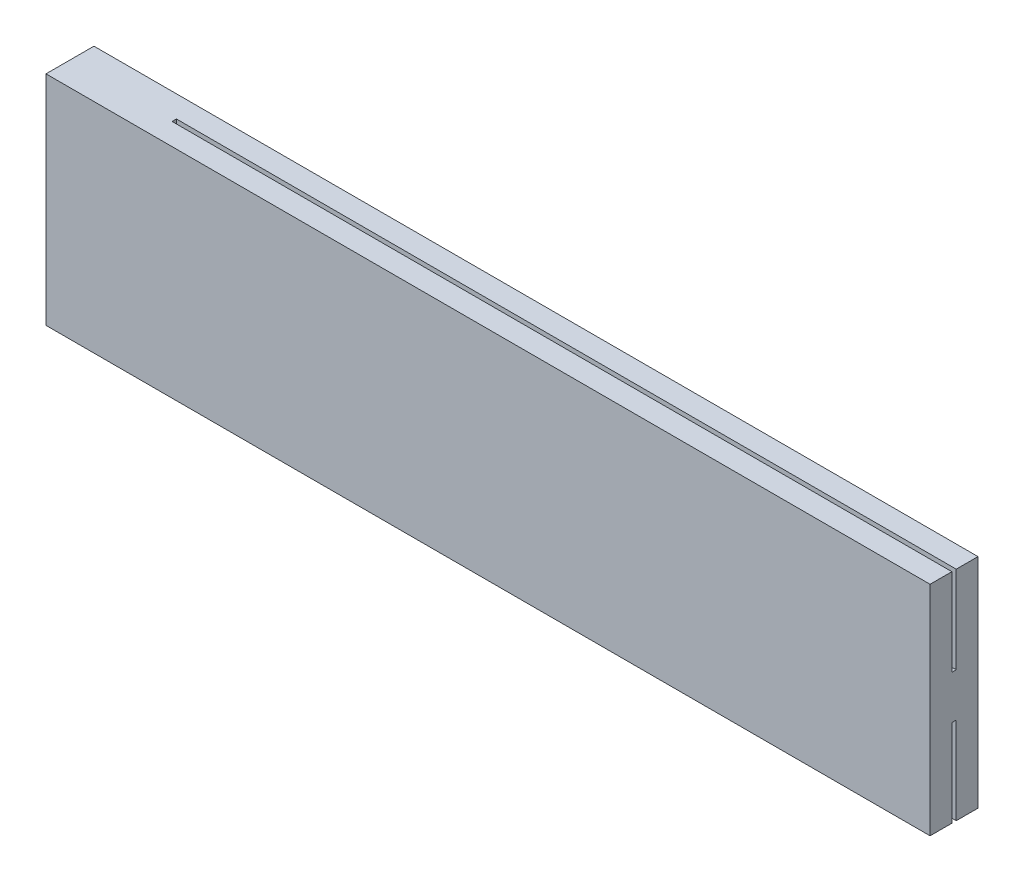
ISO-10303-21;
HEADER;
FILE_DESCRIPTION(('STEP AP214'),'2;1');
FILE_NAME('part.step','',(''),(''),'','','');
FILE_SCHEMA(('AUTOMOTIVE_DESIGN { 1 0 10303 214 1 1 1 1 }'));
ENDSEC;
DATA;
#1=APPLICATION_CONTEXT('core data for automotive mechanical design processes');
#2=APPLICATION_PROTOCOL_DEFINITION('international standard','automotive_design',2000,#1);
#3=PRODUCT_CONTEXT('',#1,'mechanical');
#4=PRODUCT('Part','Part','',(#3));
#5=PRODUCT_RELATED_PRODUCT_CATEGORY('part','',(#4));
#6=PRODUCT_DEFINITION_FORMATION('','',#4);
#7=PRODUCT_DEFINITION_CONTEXT('part definition',#1,'design');
#8=PRODUCT_DEFINITION('design','',#6,#7);
#9=PRODUCT_DEFINITION_SHAPE('','',#8);
#10=(LENGTH_UNIT() NAMED_UNIT(*) SI_UNIT(.MILLI.,.METRE.));
#11=(NAMED_UNIT(*) PLANE_ANGLE_UNIT() SI_UNIT($,.RADIAN.));
#12=(NAMED_UNIT(*) SI_UNIT($,.STERADIAN.) SOLID_ANGLE_UNIT());
#13=UNCERTAINTY_MEASURE_WITH_UNIT(LENGTH_MEASURE(1.E-05),#10,'distance_accuracy_value','');
#14=(GEOMETRIC_REPRESENTATION_CONTEXT(3) GLOBAL_UNCERTAINTY_ASSIGNED_CONTEXT((#13)) GLOBAL_UNIT_ASSIGNED_CONTEXT((#10,
#11,#12)) REPRESENTATION_CONTEXT('',''));
#15=CARTESIAN_POINT('',(0.,0.,0.));
#16=DIRECTION('',(0.,0.,1.));
#17=DIRECTION('',(1.,0.,0.));
#18=AXIS2_PLACEMENT_3D('',#15,#16,#17);
#19=CARTESIAN_POINT('',(269.280488051475,-140.,-12.));
#20=DIRECTION('',(0.,0.,1.));
#21=DIRECTION('',(0.,-1.,0.));
#22=AXIS2_PLACEMENT_3D('',#19,#20,#21);
#23=PLANE('',#22);
#24=DIRECTION('',(0.,1.,0.));
#25=VECTOR('',#24,1.);
#26=CARTESIAN_POINT('',(166.889082162113,-140.,-12.));
#27=LINE('',#26,#25);
#28=CARTESIAN_POINT('',(166.889082162113,-240.,-12.));
#29=VERTEX_POINT('',#28);
#30=CARTESIAN_POINT('',(166.889082162113,-140.,-12.));
#31=VERTEX_POINT('',#30);
#32=EDGE_CURVE('E187',#29,#31,#27,.T.);
#33=ORIENTED_EDGE('',*,*,#32,.F.);
#34=DIRECTION('',(-1.,0.,0.));
#35=VECTOR('',#34,1.);
#36=CARTESIAN_POINT('',(269.280488051475,-240.,-12.));
#37=LINE('',#36,#35);
#38=CARTESIAN_POINT('',(-238.865533981584,-240.,-12.));
#39=VERTEX_POINT('',#38);
#40=EDGE_CURVE('E173',#29,#39,#37,.T.);
#41=ORIENTED_EDGE('',*,*,#40,.T.);
#42=DIRECTION('',(0.,1.,0.));
#43=VECTOR('',#42,1.);
#44=CARTESIAN_POINT('',(-238.865533981584,-140.,-12.));
#45=LINE('',#44,#43);
#46=CARTESIAN_POINT('',(-238.865533981584,-140.,-12.));
#47=VERTEX_POINT('',#46);
#48=EDGE_CURVE('E170',#39,#47,#45,.T.);
#49=ORIENTED_EDGE('',*,*,#48,.T.);
#50=DIRECTION('',(-1.,0.,0.));
#51=VECTOR('',#50,1.);
#52=CARTESIAN_POINT('',(269.280488051475,-140.,-12.));
#53=LINE('',#52,#51);
#54=EDGE_CURVE('E194',#31,#47,#53,.T.);
#55=ORIENTED_EDGE('',*,*,#54,.F.);
#56=EDGE_LOOP('',(#33,#41,#49,#55));
#57=FACE_BOUND('',#56,.T.);
#58=ADVANCED_FACE('F34',(#57),#23,.F.);
#59=CARTESIAN_POINT('',(269.280488051475,-140.,-12.));
#60=DIRECTION('',(0.,-1.,0.));
#61=DIRECTION('',(0.,0.,-1.));
#62=AXIS2_PLACEMENT_3D('',#59,#60,#61);
#63=PLANE('',#62);
#64=DIRECTION('',(0.,0.,1.));
#65=VECTOR('',#64,1.);
#66=CARTESIAN_POINT('',(166.889082162113,-140.,-12.));
#67=LINE('',#66,#65);
#68=CARTESIAN_POINT('',(166.889082162113,-140.,0.));
#69=VERTEX_POINT('',#68);
#70=CARTESIAN_POINT('',(166.889082162113,-140.,9.99999999999998));
#71=VERTEX_POINT('',#70);
#72=EDGE_CURVE('E186',#69,#71,#67,.T.);
#73=ORIENTED_EDGE('',*,*,#72,.F.);
#74=DIRECTION('',(-1.,0.,0.));
#75=VECTOR('',#74,1.);
#76=CARTESIAN_POINT('',(269.280488051475,-140.,0.));
#77=LINE('',#76,#75);
#78=CARTESIAN_POINT('',(-191.,-140.,0.));
#79=VERTEX_POINT('',#78);
#80=EDGE_CURVE('E163',#69,#79,#77,.T.);
#81=ORIENTED_EDGE('',*,*,#80,.T.);
#82=DIRECTION('',(0.,0.,-1.));
#83=VECTOR('',#82,1.);
#84=CARTESIAN_POINT('',(-191.,-140.,-12.));
#85=LINE('',#84,#83);
#86=CARTESIAN_POINT('',(-191.,-140.,-2.));
#87=VERTEX_POINT('',#86);
#88=EDGE_CURVE('E207',#79,#87,#85,.T.);
#89=ORIENTED_EDGE('',*,*,#88,.T.);
#90=DIRECTION('',(-1.,0.,0.));
#91=VECTOR('',#90,1.);
#92=CARTESIAN_POINT('',(269.280488051475,-140.,-2.));
#93=LINE('',#92,#91);
#94=CARTESIAN_POINT('',(166.889082162113,-140.,-2.0000000000002));
#95=VERTEX_POINT('',#94);
#96=EDGE_CURVE('E161',#95,#87,#93,.T.);
#97=ORIENTED_EDGE('',*,*,#96,.F.);
#98=EDGE_CURVE('E183',#31,#95,#67,.T.);
#99=ORIENTED_EDGE('',*,*,#98,.F.);
#100=ORIENTED_EDGE('',*,*,#54,.T.);
#101=DIRECTION('',(0.,0.,1.));
#102=VECTOR('',#101,1.);
#103=CARTESIAN_POINT('',(-238.865533981584,-140.,-12.));
#104=LINE('',#103,#102);
#105=CARTESIAN_POINT('',(-238.865533981584,-140.,9.99999999999998));
#106=VERTEX_POINT('',#105);
#107=EDGE_CURVE('E166',#47,#106,#104,.T.);
#108=ORIENTED_EDGE('',*,*,#107,.T.);
#109=DIRECTION('',(-1.,0.,0.));
#110=VECTOR('',#109,1.);
#111=CARTESIAN_POINT('',(269.280488051475,-140.,9.99999999999998));
#112=LINE('',#111,#110);
#113=EDGE_CURVE('E196',#71,#106,#112,.T.);
#114=ORIENTED_EDGE('',*,*,#113,.F.);
#115=EDGE_LOOP('',(#73,#81,#89,#97,#99,#100,#108,#114));
#116=FACE_BOUND('',#115,.T.);
#117=ADVANCED_FACE('F227',(#116),#63,.F.);
#118=CARTESIAN_POINT('',(269.280488051475,-140.,9.99999999999998));
#119=DIRECTION('',(0.,0.,-1.));
#120=DIRECTION('',(0.,1.,0.));
#121=AXIS2_PLACEMENT_3D('',#118,#119,#120);
#122=PLANE('',#121);
#123=DIRECTION('',(0.,-1.,0.));
#124=VECTOR('',#123,1.);
#125=CARTESIAN_POINT('',(166.889082162113,-140.,9.99999999999998));
#126=LINE('',#125,#124);
#127=CARTESIAN_POINT('',(166.889082162113,-240.,9.99999999999995));
#128=VERTEX_POINT('',#127);
#129=EDGE_CURVE('E179',#71,#128,#126,.T.);
#130=ORIENTED_EDGE('',*,*,#129,.F.);
#131=ORIENTED_EDGE('',*,*,#113,.T.);
#132=DIRECTION('',(0.,-1.,0.));
#133=VECTOR('',#132,1.);
#134=CARTESIAN_POINT('',(-238.865533981584,-140.,9.99999999999998));
#135=LINE('',#134,#133);
#136=CARTESIAN_POINT('',(-238.865533981584,-240.,9.99999999999995));
#137=VERTEX_POINT('',#136);
#138=EDGE_CURVE('E169',#106,#137,#135,.T.);
#139=ORIENTED_EDGE('',*,*,#138,.T.);
#140=DIRECTION('',(-1.,0.,0.));
#141=VECTOR('',#140,1.);
#142=CARTESIAN_POINT('',(269.280488051475,-240.,9.99999999999995));
#143=LINE('',#142,#141);
#144=EDGE_CURVE('E198',#128,#137,#143,.T.);
#145=ORIENTED_EDGE('',*,*,#144,.F.);
#146=EDGE_LOOP('',(#130,#131,#139,#145));
#147=FACE_BOUND('',#146,.T.);
#148=ADVANCED_FACE('F224',(#147),#122,.F.);
#149=CARTESIAN_POINT('',(269.280488051475,-240.,-12.));
#150=DIRECTION('',(0.,1.,0.));
#151=DIRECTION('',(0.,0.,1.));
#152=AXIS2_PLACEMENT_3D('',#149,#150,#151);
#153=PLANE('',#152);
#154=DIRECTION('',(0.,0.,1.));
#155=VECTOR('',#154,1.);
#156=CARTESIAN_POINT('',(-191.,-240.,-12.));
#157=LINE('',#156,#155);
#158=CARTESIAN_POINT('',(-191.,-240.,-2.00000000000019));
#159=VERTEX_POINT('',#158);
#160=CARTESIAN_POINT('',(-191.,-240.,-1.89242561015651E-13));
#161=VERTEX_POINT('',#160);
#162=EDGE_CURVE('E11',#159,#161,#157,.T.);
#163=ORIENTED_EDGE('',*,*,#162,.T.);
#164=DIRECTION('',(1.,0.,0.));
#165=VECTOR('',#164,1.);
#166=CARTESIAN_POINT('',(269.280488051475,-240.,-1.90819582357449E-13));
#167=LINE('',#166,#165);
#168=CARTESIAN_POINT('',(166.889082162113,-240.,-1.89130056615707E-13));
#169=VERTEX_POINT('',#168);
#170=EDGE_CURVE('E147',#161,#169,#167,.T.);
#171=ORIENTED_EDGE('',*,*,#170,.T.);
#172=DIRECTION('',(0.,0.,-1.));
#173=VECTOR('',#172,1.);
#174=CARTESIAN_POINT('',(166.889082162113,-240.,-12.));
#175=LINE('',#174,#173);
#176=EDGE_CURVE('E190',#128,#169,#175,.T.);
#177=ORIENTED_EDGE('',*,*,#176,.F.);
#178=ORIENTED_EDGE('',*,*,#144,.T.);
#179=DIRECTION('',(0.,0.,-1.));
#180=VECTOR('',#179,1.);
#181=CARTESIAN_POINT('',(-238.865533981584,-240.,-12.));
#182=LINE('',#181,#180);
#183=EDGE_CURVE('E174',#137,#39,#182,.T.);
#184=ORIENTED_EDGE('',*,*,#183,.T.);
#185=ORIENTED_EDGE('',*,*,#40,.F.);
#186=CARTESIAN_POINT('',(166.889082162113,-240.,-1.99999999999939));
#187=VERTEX_POINT('',#186);
#188=EDGE_CURVE('E193',#187,#29,#175,.T.);
#189=ORIENTED_EDGE('',*,*,#188,.F.);
#190=DIRECTION('',(1.,0.,0.));
#191=VECTOR('',#190,1.);
#192=CARTESIAN_POINT('',(269.280488051475,-240.,-2.00000000000019));
#193=LINE('',#192,#191);
#194=EDGE_CURVE('E49',#159,#187,#193,.T.);
#195=ORIENTED_EDGE('',*,*,#194,.F.);
#196=EDGE_LOOP('',(#163,#171,#177,#178,#184,#185,#189,#195));
#197=FACE_BOUND('',#196,.T.);
#198=ADVANCED_FACE('F218',(#197),#153,.F.);
#199=CARTESIAN_POINT('',(166.889082162113,-434.321391588462,-2.0000000000002));
#200=DIRECTION('',(1.,0.,0.));
#201=DIRECTION('',(0.,1.,0.));
#202=AXIS2_PLACEMENT_3D('',#199,#200,#201);
#203=PLANE('',#202);
#204=DIRECTION('',(0.,-1.,0.));
#205=VECTOR('',#204,1.);
#206=CARTESIAN_POINT('',(166.889082162113,-434.321391588462,-9.24607612695638E-13));
#207=LINE('',#206,#205);
#208=CARTESIAN_POINT('',(166.889082162113,-200.,0.));
#209=VERTEX_POINT('',#208);
#210=EDGE_CURVE('E42',#209,#169,#207,.T.);
#211=ORIENTED_EDGE('',*,*,#210,.F.);
#212=DIRECTION('',(0.,0.,1.));
#213=VECTOR('',#212,1.);
#214=CARTESIAN_POINT('',(166.889082162113,-200.,-1.99999999999931));
#215=LINE('',#214,#213);
#216=CARTESIAN_POINT('',(166.889082162113,-200.,-2.00000000000004));
#217=VERTEX_POINT('',#216);
#218=EDGE_CURVE('E211',#217,#209,#215,.T.);
#219=ORIENTED_EDGE('',*,*,#218,.F.);
#220=DIRECTION('',(0.,-1.,0.));
#221=VECTOR('',#220,1.);
#222=CARTESIAN_POINT('',(166.889082162113,-434.321391588462,-2.0000000000002));
#223=LINE('',#222,#221);
#224=EDGE_CURVE('E140',#217,#187,#223,.T.);
#225=ORIENTED_EDGE('',*,*,#224,.T.);
#226=ORIENTED_EDGE('',*,*,#188,.T.);
#227=ORIENTED_EDGE('',*,*,#32,.T.);
#228=ORIENTED_EDGE('',*,*,#98,.T.);
#229=DIRECTION('',(0.,-1.,0.));
#230=VECTOR('',#229,1.);
#231=CARTESIAN_POINT('',(166.889082162113,-434.321391588462,-2.0000000000002));
#232=LINE('',#231,#230);
#233=CARTESIAN_POINT('',(166.889082162113,-180.,-2.0000000000002));
#234=VERTEX_POINT('',#233);
#235=EDGE_CURVE('E182',#95,#234,#232,.T.);
#236=ORIENTED_EDGE('',*,*,#235,.T.);
#237=DIRECTION('',(0.,0.,-1.));
#238=VECTOR('',#237,1.);
#239=CARTESIAN_POINT('',(166.889082162113,-180.,-2.0000000000002));
#240=LINE('',#239,#238);
#241=CARTESIAN_POINT('',(166.889082162113,-180.,0.));
#242=VERTEX_POINT('',#241);
#243=EDGE_CURVE('E203',#242,#234,#240,.T.);
#244=ORIENTED_EDGE('',*,*,#243,.F.);
#245=DIRECTION('',(0.,-1.,0.));
#246=VECTOR('',#245,1.);
#247=CARTESIAN_POINT('',(166.889082162113,-434.321391588462,0.));
#248=LINE('',#247,#246);
#249=EDGE_CURVE('E205',#69,#242,#248,.T.);
#250=ORIENTED_EDGE('',*,*,#249,.F.);
#251=ORIENTED_EDGE('',*,*,#72,.T.);
#252=ORIENTED_EDGE('',*,*,#129,.T.);
#253=ORIENTED_EDGE('',*,*,#176,.T.);
#254=EDGE_LOOP('',(#211,#219,#225,#226,#227,#228,#236,#244,#250,#251,#252,#253));
#255=FACE_BOUND('',#254,.T.);
#256=ADVANCED_FACE('F36',(#255),#203,.T.);
#257=CARTESIAN_POINT('',(-238.865533981584,-434.321391588462,9.99999999999993));
#258=DIRECTION('',(-1.,0.,0.));
#259=DIRECTION('',(0.,1.,0.));
#260=AXIS2_PLACEMENT_3D('',#257,#258,#259);
#261=PLANE('',#260);
#262=ORIENTED_EDGE('',*,*,#48,.F.);
#263=ORIENTED_EDGE('',*,*,#183,.F.);
#264=ORIENTED_EDGE('',*,*,#138,.F.);
#265=ORIENTED_EDGE('',*,*,#107,.F.);
#266=EDGE_LOOP('',(#262,#263,#264,#265));
#267=FACE_BOUND('',#266,.T.);
#268=ADVANCED_FACE('F232',(#267),#261,.T.);
#269=CARTESIAN_POINT('',(-191.,225.,-2.));
#270=DIRECTION('',(-1.,0.,0.));
#271=DIRECTION('',(0.,0.,1.));
#272=AXIS2_PLACEMENT_3D('',#269,#270,#271);
#273=PLANE('',#272);
#274=DIRECTION('',(0.,-1.,0.));
#275=VECTOR('',#274,1.);
#276=CARTESIAN_POINT('',(-191.,225.,0.));
#277=LINE('',#276,#275);
#278=CARTESIAN_POINT('',(-191.,-180.,0.));
#279=VERTEX_POINT('',#278);
#280=EDGE_CURVE('E150',#79,#279,#277,.T.);
#281=ORIENTED_EDGE('',*,*,#280,.T.);
#282=DIRECTION('',(0.,0.,1.));
#283=VECTOR('',#282,1.);
#284=CARTESIAN_POINT('',(-191.,-180.,-2.));
#285=LINE('',#284,#283);
#286=CARTESIAN_POINT('',(-191.,-180.,-2.));
#287=VERTEX_POINT('',#286);
#288=EDGE_CURVE('E155',#287,#279,#285,.T.);
#289=ORIENTED_EDGE('',*,*,#288,.F.);
#290=DIRECTION('',(0.,-1.,0.));
#291=VECTOR('',#290,1.);
#292=CARTESIAN_POINT('',(-191.,225.,-2.));
#293=LINE('',#292,#291);
#294=EDGE_CURVE('E151',#87,#287,#293,.T.);
#295=ORIENTED_EDGE('',*,*,#294,.F.);
#296=ORIENTED_EDGE('',*,*,#88,.F.);
#297=EDGE_LOOP('',(#281,#289,#295,#296));
#298=FACE_BOUND('',#297,.T.);
#299=ADVANCED_FACE('F244',(#298),#273,.F.);
#300=CARTESIAN_POINT('',(0.,0.,0.));
#301=DIRECTION('',(0.,0.,1.));
#302=DIRECTION('',(1.,0.,0.));
#303=AXIS2_PLACEMENT_3D('',#300,#301,#302);
#304=PLANE('',#303);
#305=ORIENTED_EDGE('',*,*,#249,.T.);
#306=DIRECTION('',(1.,0.,0.));
#307=VECTOR('',#306,1.);
#308=CARTESIAN_POINT('',(-191.,-180.,0.));
#309=LINE('',#308,#307);
#310=EDGE_CURVE('E153',#279,#242,#309,.T.);
#311=ORIENTED_EDGE('',*,*,#310,.F.);
#312=ORIENTED_EDGE('',*,*,#280,.F.);
#313=ORIENTED_EDGE('',*,*,#80,.F.);
#314=EDGE_LOOP('',(#305,#311,#312,#313));
#315=FACE_BOUND('',#314,.T.);
#316=ADVANCED_FACE('F250',(#315),#304,.F.);
#317=CARTESIAN_POINT('',(0.,0.,-2.));
#318=DIRECTION('',(0.,0.,1.));
#319=DIRECTION('',(1.,0.,0.));
#320=AXIS2_PLACEMENT_3D('',#317,#318,#319);
#321=PLANE('',#320);
#322=ORIENTED_EDGE('',*,*,#96,.T.);
#323=ORIENTED_EDGE('',*,*,#294,.T.);
#324=DIRECTION('',(1.,0.,0.));
#325=VECTOR('',#324,1.);
#326=CARTESIAN_POINT('',(-191.,-180.,-2.));
#327=LINE('',#326,#325);
#328=EDGE_CURVE('E57',#287,#234,#327,.T.);
#329=ORIENTED_EDGE('',*,*,#328,.T.);
#330=ORIENTED_EDGE('',*,*,#235,.F.);
#331=EDGE_LOOP('',(#322,#323,#329,#330));
#332=FACE_BOUND('',#331,.T.);
#333=ADVANCED_FACE('F241',(#332),#321,.T.);
#334=CARTESIAN_POINT('',(-191.,-180.,-2.));
#335=DIRECTION('',(0.,-1.,0.));
#336=DIRECTION('',(0.,0.,1.));
#337=AXIS2_PLACEMENT_3D('',#334,#335,#336);
#338=PLANE('',#337);
#339=ORIENTED_EDGE('',*,*,#243,.T.);
#340=ORIENTED_EDGE('',*,*,#328,.F.);
#341=ORIENTED_EDGE('',*,*,#288,.T.);
#342=ORIENTED_EDGE('',*,*,#310,.T.);
#343=EDGE_LOOP('',(#339,#340,#341,#342));
#344=FACE_BOUND('',#343,.T.);
#345=ADVANCED_FACE('F248',(#344),#338,.F.);
#346=CARTESIAN_POINT('',(-191.,-605.,-2.00000000000157));
#347=DIRECTION('',(-1.,0.,0.));
#348=DIRECTION('',(0.,0.,1.));
#349=AXIS2_PLACEMENT_3D('',#346,#347,#348);
#350=PLANE('',#349);
#351=DIRECTION('',(0.,1.,0.));
#352=VECTOR('',#351,1.);
#353=CARTESIAN_POINT('',(-191.,-605.,-2.00000000000157));
#354=LINE('',#353,#352);
#355=CARTESIAN_POINT('',(-191.,-200.,-2.00000000000004));
#356=VERTEX_POINT('',#355);
#357=EDGE_CURVE('E123',#159,#356,#354,.T.);
#358=ORIENTED_EDGE('',*,*,#357,.T.);
#359=DIRECTION('',(0.,0.,1.));
#360=VECTOR('',#359,1.);
#361=CARTESIAN_POINT('',(-191.,-200.,-2.00000000000004));
#362=LINE('',#361,#360);
#363=CARTESIAN_POINT('',(-191.,-200.,0.));
#364=VERTEX_POINT('',#363);
#365=EDGE_CURVE('E127',#356,#364,#362,.T.);
#366=ORIENTED_EDGE('',*,*,#365,.T.);
#367=DIRECTION('',(0.,1.,0.));
#368=VECTOR('',#367,1.);
#369=CARTESIAN_POINT('',(-191.,-605.,-1.57071325642991E-12));
#370=LINE('',#369,#368);
#371=EDGE_CURVE('E143',#161,#364,#370,.T.);
#372=ORIENTED_EDGE('',*,*,#371,.F.);
#373=ORIENTED_EDGE('',*,*,#162,.F.);
#374=EDGE_LOOP('',(#358,#366,#372,#373));
#375=FACE_BOUND('',#374,.T.);
#376=ADVANCED_FACE('F125',(#375),#350,.F.);
#377=CARTESIAN_POINT('',(0.,-380.,-7.19121731859478E-13));
#378=DIRECTION('',(0.,0.,1.));
#379=DIRECTION('',(1.,0.,0.));
#380=AXIS2_PLACEMENT_3D('',#377,#378,#379);
#381=PLANE('',#380);
#382=ORIENTED_EDGE('',*,*,#371,.T.);
#383=DIRECTION('',(1.,0.,0.));
#384=VECTOR('',#383,1.);
#385=CARTESIAN_POINT('',(-191.,-200.,0.));
#386=LINE('',#385,#384);
#387=EDGE_CURVE('E131',#364,#209,#386,.T.);
#388=ORIENTED_EDGE('',*,*,#387,.T.);
#389=ORIENTED_EDGE('',*,*,#210,.T.);
#390=ORIENTED_EDGE('',*,*,#170,.F.);
#391=EDGE_LOOP('',(#382,#388,#389,#390));
#392=FACE_BOUND('',#391,.T.);
#393=ADVANCED_FACE('F214',(#392),#381,.F.);
#394=CARTESIAN_POINT('',(0.,-380.,-2.00000000000072));
#395=DIRECTION('',(0.,0.,1.));
#396=DIRECTION('',(1.,0.,0.));
#397=AXIS2_PLACEMENT_3D('',#394,#395,#396);
#398=PLANE('',#397);
#399=ORIENTED_EDGE('',*,*,#194,.T.);
#400=ORIENTED_EDGE('',*,*,#224,.F.);
#401=DIRECTION('',(1.,0.,0.));
#402=VECTOR('',#401,1.);
#403=CARTESIAN_POINT('',(-191.,-200.,-2.00000000000004));
#404=LINE('',#403,#402);
#405=EDGE_CURVE('E130',#356,#217,#404,.T.);
#406=ORIENTED_EDGE('',*,*,#405,.F.);
#407=ORIENTED_EDGE('',*,*,#357,.F.);
#408=EDGE_LOOP('',(#399,#400,#406,#407));
#409=FACE_BOUND('',#408,.T.);
#410=ADVANCED_FACE('F139',(#409),#398,.T.);
#411=CARTESIAN_POINT('',(-191.,-200.,-2.00000000000004));
#412=DIRECTION('',(0.,1.,0.));
#413=DIRECTION('',(0.,0.,1.));
#414=AXIS2_PLACEMENT_3D('',#411,#412,#413);
#415=PLANE('',#414);
#416=ORIENTED_EDGE('',*,*,#218,.T.);
#417=ORIENTED_EDGE('',*,*,#387,.F.);
#418=ORIENTED_EDGE('',*,*,#365,.F.);
#419=ORIENTED_EDGE('',*,*,#405,.T.);
#420=EDGE_LOOP('',(#416,#417,#418,#419));
#421=FACE_BOUND('',#420,.T.);
#422=ADVANCED_FACE('F135',(#421),#415,.F.);
#423=CLOSED_SHELL('',(#58,#117,#148,#198,#256,#268,#299,#316,#333,#345,#376,#393,#410,#422));
#424=MANIFOLD_SOLID_BREP('B2',#423);
#425=ADVANCED_BREP_SHAPE_REPRESENTATION('',(#18,#424),#14);
#426=SHAPE_DEFINITION_REPRESENTATION(#9,#425);
ENDSEC;
END-ISO-10303-21;
